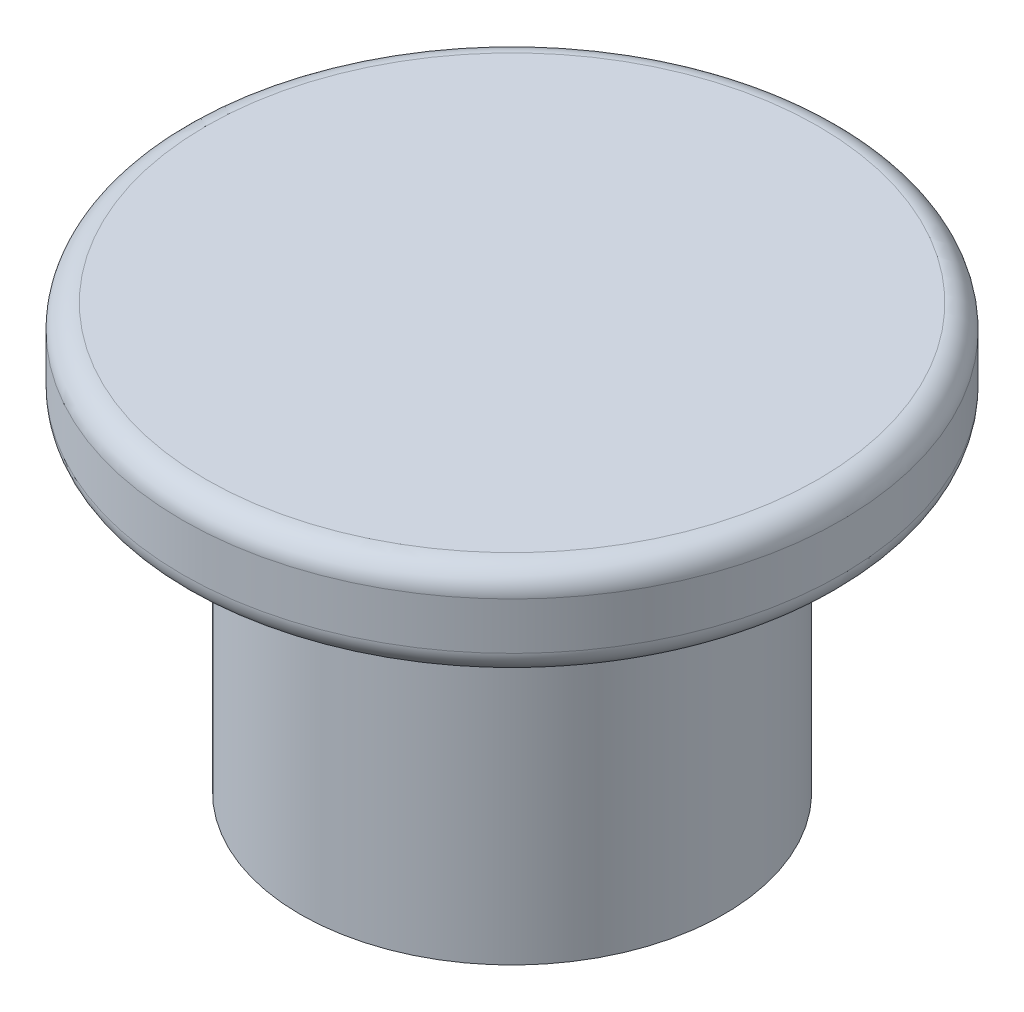
ISO-10303-21;
HEADER;
FILE_DESCRIPTION(('STEP AP214'),'2;1');
FILE_NAME('part.step','',(''),(''),'','','');
FILE_SCHEMA(('AUTOMOTIVE_DESIGN { 1 0 10303 214 1 1 1 1 }'));
ENDSEC;
DATA;
#1=APPLICATION_CONTEXT('core data for automotive mechanical design processes');
#2=APPLICATION_PROTOCOL_DEFINITION('international standard','automotive_design',2000,#1);
#3=PRODUCT_CONTEXT('',#1,'mechanical');
#4=PRODUCT('Part','Part','',(#3));
#5=PRODUCT_RELATED_PRODUCT_CATEGORY('part','',(#4));
#6=PRODUCT_DEFINITION_FORMATION('','',#4);
#7=PRODUCT_DEFINITION_CONTEXT('part definition',#1,'design');
#8=PRODUCT_DEFINITION('design','',#6,#7);
#9=PRODUCT_DEFINITION_SHAPE('','',#8);
#10=(LENGTH_UNIT() NAMED_UNIT(*) SI_UNIT(.MILLI.,.METRE.));
#11=(NAMED_UNIT(*) PLANE_ANGLE_UNIT() SI_UNIT($,.RADIAN.));
#12=(NAMED_UNIT(*) SI_UNIT($,.STERADIAN.) SOLID_ANGLE_UNIT());
#13=UNCERTAINTY_MEASURE_WITH_UNIT(LENGTH_MEASURE(1.E-05),#10,'distance_accuracy_value','');
#14=(GEOMETRIC_REPRESENTATION_CONTEXT(3) GLOBAL_UNCERTAINTY_ASSIGNED_CONTEXT((#13)) GLOBAL_UNIT_ASSIGNED_CONTEXT((#10,
#11,#12)) REPRESENTATION_CONTEXT('',''));
#15=CARTESIAN_POINT('',(0.,0.,0.));
#16=DIRECTION('',(0.,0.,1.));
#17=DIRECTION('',(1.,0.,0.));
#18=AXIS2_PLACEMENT_3D('',#15,#16,#17);
#19=CARTESIAN_POINT('',(0.,1.,0.));
#20=DIRECTION('',(0.,-1.,0.));
#21=DIRECTION('',(0.,0.,-1.));
#22=AXIS2_PLACEMENT_3D('',#19,#20,#21);
#23=CYLINDRICAL_SURFACE('',#22,3.5);
#24=CARTESIAN_POINT('',(0.,0.25,0.));
#25=DIRECTION('',(0.,1.,0.));
#26=DIRECTION('',(0.,0.,1.));
#27=AXIS2_PLACEMENT_3D('',#24,#25,#26);
#28=CIRCLE('',#27,3.5);
#29=CARTESIAN_POINT('',(0.,0.25,3.5));
#30=VERTEX_POINT('',#29);
#31=EDGE_CURVE('E68',#30,#30,#28,.T.);
#32=ORIENTED_EDGE('',*,*,#31,.T.);
#33=EDGE_LOOP('',(#32));
#34=FACE_BOUND('',#33,.T.);
#35=CARTESIAN_POINT('',(0.,0.75,0.));
#36=DIRECTION('',(0.,1.,0.));
#37=DIRECTION('',(0.,0.,1.));
#38=AXIS2_PLACEMENT_3D('',#35,#36,#37);
#39=CIRCLE('',#38,3.5);
#40=CARTESIAN_POINT('',(0.,0.75,3.5));
#41=VERTEX_POINT('',#40);
#42=EDGE_CURVE('E69',#41,#41,#39,.F.);
#43=ORIENTED_EDGE('',*,*,#42,.T.);
#44=EDGE_LOOP('',(#43));
#45=FACE_BOUND('',#44,.T.);
#46=ADVANCED_FACE('F39',(#34,#45),#23,.T.);
#47=CARTESIAN_POINT('',(0.,1.,0.));
#48=DIRECTION('',(0.,1.,0.));
#49=DIRECTION('',(0.,0.,1.));
#50=AXIS2_PLACEMENT_3D('',#47,#48,#49);
#51=PLANE('',#50);
#52=CARTESIAN_POINT('',(0.,1.,0.));
#53=DIRECTION('',(0.,1.,0.));
#54=DIRECTION('',(0.,0.,1.));
#55=AXIS2_PLACEMENT_3D('',#52,#53,#54);
#56=CIRCLE('',#55,3.25);
#57=CARTESIAN_POINT('',(0.,1.,3.25));
#58=VERTEX_POINT('',#57);
#59=EDGE_CURVE('E77',#58,#58,#56,.T.);
#60=ORIENTED_EDGE('',*,*,#59,.T.);
#61=EDGE_LOOP('',(#60));
#62=FACE_BOUND('',#61,.T.);
#63=ADVANCED_FACE('F88',(#62),#51,.T.);
#64=CARTESIAN_POINT('',(0.,0.,0.));
#65=DIRECTION('',(0.,1.,0.));
#66=DIRECTION('',(0.,0.,1.));
#67=AXIS2_PLACEMENT_3D('',#64,#65,#66);
#68=PLANE('',#67);
#69=CARTESIAN_POINT('',(0.,0.,0.));
#70=DIRECTION('',(0.,1.,0.));
#71=DIRECTION('',(0.,0.,1.));
#72=AXIS2_PLACEMENT_3D('',#69,#70,#71);
#73=CIRCLE('',#72,3.25);
#74=CARTESIAN_POINT('',(0.,0.,3.25));
#75=VERTEX_POINT('',#74);
#76=EDGE_CURVE('E72',#75,#75,#73,.F.);
#77=ORIENTED_EDGE('',*,*,#76,.T.);
#78=EDGE_LOOP('',(#77));
#79=FACE_BOUND('',#78,.T.);
#80=CARTESIAN_POINT('',(0.,0.,0.));
#81=DIRECTION('',(0.,-1.,0.));
#82=DIRECTION('',(0.,0.,-1.));
#83=AXIS2_PLACEMENT_3D('',#80,#81,#82);
#84=CIRCLE('',#83,2.25);
#85=CARTESIAN_POINT('',(0.,0.,-2.25));
#86=VERTEX_POINT('',#85);
#87=EDGE_CURVE('E65',#86,#86,#84,.T.);
#88=ORIENTED_EDGE('',*,*,#87,.F.);
#89=EDGE_LOOP('',(#88));
#90=FACE_BOUND('',#89,.T.);
#91=ADVANCED_FACE('F97',(#79,#90),#68,.F.);
#92=CARTESIAN_POINT('',(0.,-3.5,0.));
#93=DIRECTION('',(0.,1.,0.));
#94=DIRECTION('',(0.,0.,1.));
#95=AXIS2_PLACEMENT_3D('',#92,#93,#94);
#96=CYLINDRICAL_SURFACE('',#95,2.25);
#97=CARTESIAN_POINT('',(0.,-3.5,0.));
#98=DIRECTION('',(0.,-1.,0.));
#99=DIRECTION('',(0.,0.,-1.));
#100=AXIS2_PLACEMENT_3D('',#97,#98,#99);
#101=CIRCLE('',#100,2.25);
#102=CARTESIAN_POINT('',(0.,-3.5,-2.25));
#103=VERTEX_POINT('',#102);
#104=EDGE_CURVE('E56',#103,#103,#101,.T.);
#105=ORIENTED_EDGE('',*,*,#104,.F.);
#106=EDGE_LOOP('',(#105));
#107=FACE_BOUND('',#106,.T.);
#108=ORIENTED_EDGE('',*,*,#87,.T.);
#109=EDGE_LOOP('',(#108));
#110=FACE_BOUND('',#109,.T.);
#111=ADVANCED_FACE('F126',(#107,#110),#96,.T.);
#112=CARTESIAN_POINT('',(0.,-3.5,0.));
#113=DIRECTION('',(0.,-1.,0.));
#114=DIRECTION('',(0.,0.,-1.));
#115=AXIS2_PLACEMENT_3D('',#112,#113,#114);
#116=PLANE('',#115);
#117=CARTESIAN_POINT('',(0.,-3.5,0.));
#118=DIRECTION('',(0.,-1.,0.));
#119=DIRECTION('',(0.,0.,-1.));
#120=AXIS2_PLACEMENT_3D('',#117,#118,#119);
#121=CIRCLE('',#120,1.150000032);
#122=CARTESIAN_POINT('',(0.,-3.5,-1.150000032));
#123=VERTEX_POINT('',#122);
#124=EDGE_CURVE('E11',#123,#123,#121,.F.);
#125=ORIENTED_EDGE('',*,*,#124,.T.);
#126=EDGE_LOOP('',(#125));
#127=FACE_BOUND('',#126,.T.);
#128=ORIENTED_EDGE('',*,*,#104,.T.);
#129=EDGE_LOOP('',(#128));
#130=FACE_BOUND('',#129,.T.);
#131=ADVANCED_FACE('F102',(#127,#130),#116,.T.);
#132=CARTESIAN_POINT('',(0.,0.25,0.));
#133=DIRECTION('',(0.,1.,0.));
#134=DIRECTION('',(0.,0.,1.));
#135=AXIS2_PLACEMENT_3D('',#132,#133,#134);
#136=TOROIDAL_SURFACE('',#135,3.25,0.25);
#137=ORIENTED_EDGE('',*,*,#76,.F.);
#138=EDGE_LOOP('',(#137));
#139=FACE_BOUND('',#138,.T.);
#140=ORIENTED_EDGE('',*,*,#31,.F.);
#141=EDGE_LOOP('',(#140));
#142=FACE_BOUND('',#141,.T.);
#143=ADVANCED_FACE('F101',(#139,#142),#136,.T.);
#144=CARTESIAN_POINT('',(0.,0.75,0.));
#145=DIRECTION('',(0.,1.,0.));
#146=DIRECTION('',(0.,0.,1.));
#147=AXIS2_PLACEMENT_3D('',#144,#145,#146);
#148=TOROIDAL_SURFACE('',#147,3.25,0.25);
#149=ORIENTED_EDGE('',*,*,#42,.F.);
#150=EDGE_LOOP('',(#149));
#151=FACE_BOUND('',#150,.T.);
#152=ORIENTED_EDGE('',*,*,#59,.F.);
#153=EDGE_LOOP('',(#152));
#154=FACE_BOUND('',#153,.T.);
#155=ADVANCED_FACE('F52',(#151,#154),#148,.T.);
#156=CARTESIAN_POINT('',(0.,-1.6008606382551,0.));
#157=DIRECTION('',(0.,-1.,0.));
#158=DIRECTION('',(0.,0.,-1.));
#159=AXIS2_PLACEMENT_3D('',#156,#157,#158);
#160=CONICAL_SURFACE('',#159,1.000000032,1.02974425867665);
#161=CARTESIAN_POINT('',(0.,-1.,0.));
#162=VERTEX_POINT('',#161);
#163=VERTEX_LOOP('',#162);
#164=FACE_BOUND('',#163,.T.);
#165=CARTESIAN_POINT('',(0.,-1.6008606382551,0.));
#166=DIRECTION('',(0.,-1.,0.));
#167=DIRECTION('',(0.,0.,-1.));
#168=AXIS2_PLACEMENT_3D('',#165,#166,#167);
#169=CIRCLE('',#168,1.000000032);
#170=CARTESIAN_POINT('',(0.,-1.6008606382551,-1.000000032));
#171=VERTEX_POINT('',#170);
#172=EDGE_CURVE('E60',#171,#171,#169,.T.);
#173=ORIENTED_EDGE('',*,*,#172,.T.);
#174=EDGE_LOOP('',(#173));
#175=FACE_BOUND('',#174,.T.);
#176=ADVANCED_FACE('F47',(#164,#175),#160,.F.);
#177=CARTESIAN_POINT('',(0.,-3.5,0.));
#178=DIRECTION('',(0.,-1.,0.));
#179=DIRECTION('',(0.,0.,-1.));
#180=AXIS2_PLACEMENT_3D('',#177,#178,#179);
#181=CYLINDRICAL_SURFACE('',#180,1.000000032);
#182=CARTESIAN_POINT('',(0.,-3.35,0.));
#183=DIRECTION('',(0.,-1.,0.));
#184=DIRECTION('',(0.,0.,-1.));
#185=AXIS2_PLACEMENT_3D('',#182,#183,#184);
#186=CIRCLE('',#185,1.000000032);
#187=CARTESIAN_POINT('',(0.,-3.35,-1.000000032));
#188=VERTEX_POINT('',#187);
#189=EDGE_CURVE('E46',#188,#188,#186,.T.);
#190=ORIENTED_EDGE('',*,*,#189,.T.);
#191=EDGE_LOOP('',(#190));
#192=FACE_BOUND('',#191,.T.);
#193=ORIENTED_EDGE('',*,*,#172,.F.);
#194=EDGE_LOOP('',(#193));
#195=FACE_BOUND('',#194,.T.);
#196=ADVANCED_FACE('F55',(#192,#195),#181,.F.);
#197=CARTESIAN_POINT('',(0.,-3.35,0.));
#198=DIRECTION('',(0.,-1.,0.));
#199=DIRECTION('',(0.,0.,-1.));
#200=AXIS2_PLACEMENT_3D('',#197,#198,#199);
#201=TOROIDAL_SURFACE('',#200,1.150000032,0.15);
#202=ORIENTED_EDGE('',*,*,#124,.F.);
#203=EDGE_LOOP('',(#202));
#204=FACE_BOUND('',#203,.T.);
#205=ORIENTED_EDGE('',*,*,#189,.F.);
#206=EDGE_LOOP('',(#205));
#207=FACE_BOUND('',#206,.T.);
#208=ADVANCED_FACE('F41',(#204,#207),#201,.T.);
#209=CLOSED_SHELL('',(#46,#63,#91,#111,#131,#143,#155,#176,#196,#208));
#210=MANIFOLD_SOLID_BREP('B2',#209);
#211=ADVANCED_BREP_SHAPE_REPRESENTATION('',(#18,#210),#14);
#212=SHAPE_DEFINITION_REPRESENTATION(#9,#211);
ENDSEC;
END-ISO-10303-21;
